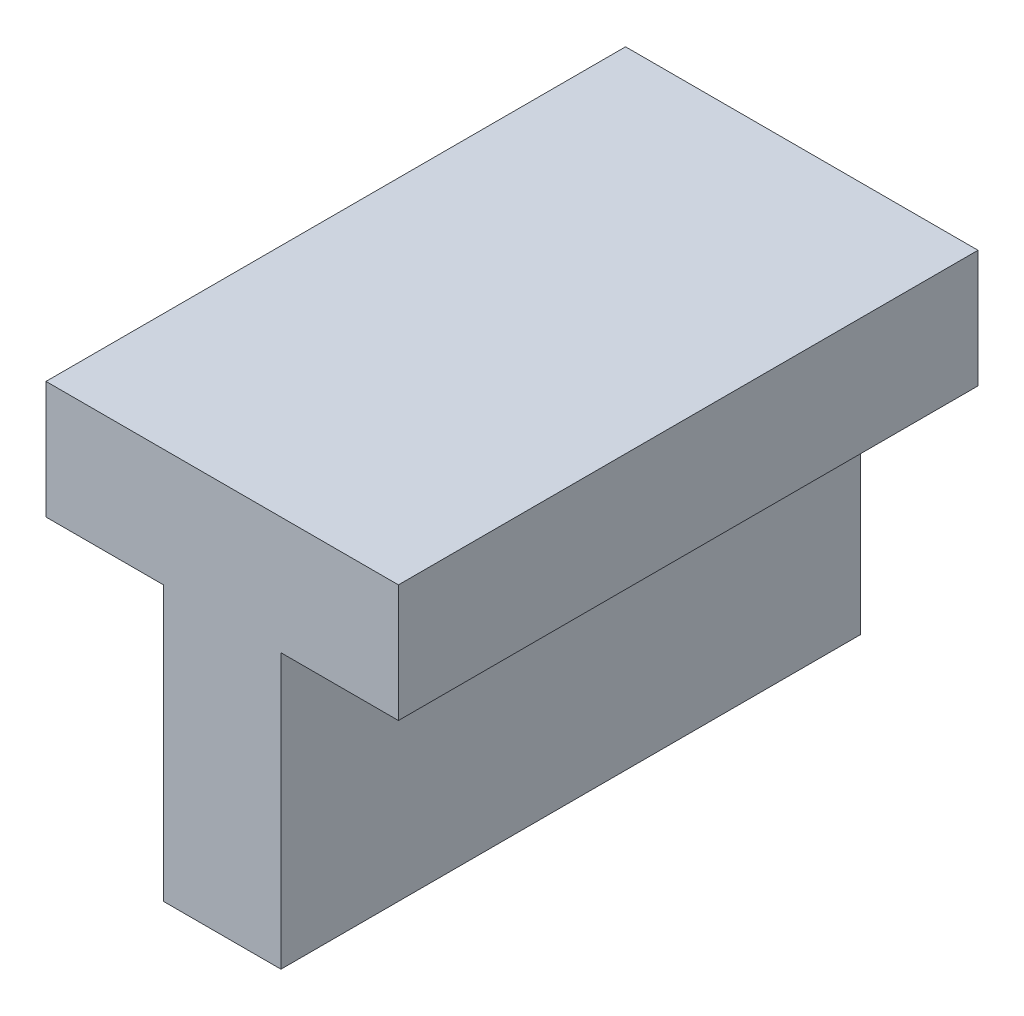
ISO-10303-21;
HEADER;
FILE_DESCRIPTION(('STEP AP214'),'2;1');
FILE_NAME('part.step','',(''),(''),'','','');
FILE_SCHEMA(('AUTOMOTIVE_DESIGN { 1 0 10303 214 1 1 1 1 }'));
ENDSEC;
DATA;
#1=APPLICATION_CONTEXT('core data for automotive mechanical design processes');
#2=APPLICATION_PROTOCOL_DEFINITION('international standard','automotive_design',2000,#1);
#3=PRODUCT_CONTEXT('',#1,'mechanical');
#4=PRODUCT('Part','Part','',(#3));
#5=PRODUCT_RELATED_PRODUCT_CATEGORY('part','',(#4));
#6=PRODUCT_DEFINITION_FORMATION('','',#4);
#7=PRODUCT_DEFINITION_CONTEXT('part definition',#1,'design');
#8=PRODUCT_DEFINITION('design','',#6,#7);
#9=PRODUCT_DEFINITION_SHAPE('','',#8);
#10=(LENGTH_UNIT() NAMED_UNIT(*) SI_UNIT(.MILLI.,.METRE.));
#11=(NAMED_UNIT(*) PLANE_ANGLE_UNIT() SI_UNIT($,.RADIAN.));
#12=(NAMED_UNIT(*) SI_UNIT($,.STERADIAN.) SOLID_ANGLE_UNIT());
#13=UNCERTAINTY_MEASURE_WITH_UNIT(LENGTH_MEASURE(1.E-05),#10,'distance_accuracy_value','');
#14=(GEOMETRIC_REPRESENTATION_CONTEXT(3) GLOBAL_UNCERTAINTY_ASSIGNED_CONTEXT((#13)) GLOBAL_UNIT_ASSIGNED_CONTEXT((#10,
#11,#12)) REPRESENTATION_CONTEXT('',''));
#15=CARTESIAN_POINT('',(0.,0.,0.));
#16=DIRECTION('',(0.,0.,1.));
#17=DIRECTION('',(1.,0.,0.));
#18=AXIS2_PLACEMENT_3D('',#15,#16,#17);
#19=CARTESIAN_POINT('',(-1.5,-3.,14.8));
#20=DIRECTION('',(1.,0.,0.));
#21=DIRECTION('',(0.,1.,0.));
#22=AXIS2_PLACEMENT_3D('',#19,#20,#21);
#23=PLANE('',#22);
#24=DIRECTION('',(0.,-1.,0.));
#25=VECTOR('',#24,1.);
#26=CARTESIAN_POINT('',(-1.5,-3.,0.));
#27=LINE('',#26,#25);
#28=CARTESIAN_POINT('',(-1.5,-3.,0.));
#29=VERTEX_POINT('',#28);
#30=CARTESIAN_POINT('',(-1.5,-10.,0.));
#31=VERTEX_POINT('',#30);
#32=EDGE_CURVE('E132',#29,#31,#27,.T.);
#33=ORIENTED_EDGE('',*,*,#32,.T.);
#34=DIRECTION('',(0.,0.,-1.));
#35=VECTOR('',#34,1.);
#36=CARTESIAN_POINT('',(-1.5,-10.,14.8));
#37=LINE('',#36,#35);
#38=CARTESIAN_POINT('',(-1.5,-10.,14.8));
#39=VERTEX_POINT('',#38);
#40=EDGE_CURVE('E11',#39,#31,#37,.T.);
#41=ORIENTED_EDGE('',*,*,#40,.F.);
#42=DIRECTION('',(0.,-1.,0.));
#43=VECTOR('',#42,1.);
#44=CARTESIAN_POINT('',(-1.5,-3.,14.8));
#45=LINE('',#44,#43);
#46=CARTESIAN_POINT('',(-1.5,-3.,14.8));
#47=VERTEX_POINT('',#46);
#48=EDGE_CURVE('E146',#47,#39,#45,.T.);
#49=ORIENTED_EDGE('',*,*,#48,.F.);
#50=DIRECTION('',(0.,0.,-1.));
#51=VECTOR('',#50,1.);
#52=CARTESIAN_POINT('',(-1.5,-3.,14.8));
#53=LINE('',#52,#51);
#54=EDGE_CURVE('E128',#47,#29,#53,.T.);
#55=ORIENTED_EDGE('',*,*,#54,.T.);
#56=EDGE_LOOP('',(#33,#41,#49,#55));
#57=FACE_BOUND('',#56,.T.);
#58=ADVANCED_FACE('F36',(#57),#23,.F.);
#59=CARTESIAN_POINT('',(-1.5,-10.,14.8));
#60=DIRECTION('',(0.,1.,0.));
#61=DIRECTION('',(0.,0.,1.));
#62=AXIS2_PLACEMENT_3D('',#59,#60,#61);
#63=PLANE('',#62);
#64=DIRECTION('',(1.,0.,0.));
#65=VECTOR('',#64,1.);
#66=CARTESIAN_POINT('',(-1.5,-10.,0.));
#67=LINE('',#66,#65);
#68=CARTESIAN_POINT('',(1.5,-10.,0.));
#69=VERTEX_POINT('',#68);
#70=EDGE_CURVE('E135',#31,#69,#67,.T.);
#71=ORIENTED_EDGE('',*,*,#70,.T.);
#72=DIRECTION('',(0.,0.,-1.));
#73=VECTOR('',#72,1.);
#74=CARTESIAN_POINT('',(1.5,-10.,14.8));
#75=LINE('',#74,#73);
#76=CARTESIAN_POINT('',(1.5,-10.,14.8));
#77=VERTEX_POINT('',#76);
#78=EDGE_CURVE('E44',#77,#69,#75,.T.);
#79=ORIENTED_EDGE('',*,*,#78,.F.);
#80=DIRECTION('',(1.,0.,0.));
#81=VECTOR('',#80,1.);
#82=CARTESIAN_POINT('',(-1.5,-10.,14.8));
#83=LINE('',#82,#81);
#84=EDGE_CURVE('E95',#39,#77,#83,.T.);
#85=ORIENTED_EDGE('',*,*,#84,.F.);
#86=ORIENTED_EDGE('',*,*,#40,.T.);
#87=EDGE_LOOP('',(#71,#79,#85,#86));
#88=FACE_BOUND('',#87,.T.);
#89=ADVANCED_FACE('F181',(#88),#63,.F.);
#90=CARTESIAN_POINT('',(1.5,-10.,14.8));
#91=DIRECTION('',(-1.,0.,0.));
#92=DIRECTION('',(0.,-1.,0.));
#93=AXIS2_PLACEMENT_3D('',#90,#91,#92);
#94=PLANE('',#93);
#95=DIRECTION('',(0.,1.,0.));
#96=VECTOR('',#95,1.);
#97=CARTESIAN_POINT('',(1.5,-10.,0.));
#98=LINE('',#97,#96);
#99=CARTESIAN_POINT('',(1.5,-3.,0.));
#100=VERTEX_POINT('',#99);
#101=EDGE_CURVE('E137',#69,#100,#98,.T.);
#102=ORIENTED_EDGE('',*,*,#101,.T.);
#103=DIRECTION('',(0.,0.,-1.));
#104=VECTOR('',#103,1.);
#105=CARTESIAN_POINT('',(1.5,-3.,14.8));
#106=LINE('',#105,#104);
#107=CARTESIAN_POINT('',(1.5,-3.,14.8));
#108=VERTEX_POINT('',#107);
#109=EDGE_CURVE('E153',#108,#100,#106,.T.);
#110=ORIENTED_EDGE('',*,*,#109,.F.);
#111=DIRECTION('',(0.,1.,0.));
#112=VECTOR('',#111,1.);
#113=CARTESIAN_POINT('',(1.5,-10.,14.8));
#114=LINE('',#113,#112);
#115=EDGE_CURVE('E161',#77,#108,#114,.T.);
#116=ORIENTED_EDGE('',*,*,#115,.F.);
#117=ORIENTED_EDGE('',*,*,#78,.T.);
#118=EDGE_LOOP('',(#102,#110,#116,#117));
#119=FACE_BOUND('',#118,.T.);
#120=ADVANCED_FACE('F159',(#119),#94,.F.);
#121=CARTESIAN_POINT('',(1.5,-3.,14.8));
#122=DIRECTION('',(0.,1.,0.));
#123=DIRECTION('',(-1.,0.,0.));
#124=AXIS2_PLACEMENT_3D('',#121,#122,#123);
#125=PLANE('',#124);
#126=DIRECTION('',(1.,0.,0.));
#127=VECTOR('',#126,1.);
#128=CARTESIAN_POINT('',(1.5,-3.,0.));
#129=LINE('',#128,#127);
#130=CARTESIAN_POINT('',(4.5,-3.,0.));
#131=VERTEX_POINT('',#130);
#132=EDGE_CURVE('E139',#100,#131,#129,.T.);
#133=ORIENTED_EDGE('',*,*,#132,.T.);
#134=DIRECTION('',(0.,0.,-1.));
#135=VECTOR('',#134,1.);
#136=CARTESIAN_POINT('',(4.5,-3.,14.8));
#137=LINE('',#136,#135);
#138=CARTESIAN_POINT('',(4.5,-3.,14.8));
#139=VERTEX_POINT('',#138);
#140=EDGE_CURVE('E150',#139,#131,#137,.T.);
#141=ORIENTED_EDGE('',*,*,#140,.F.);
#142=DIRECTION('',(1.,0.,0.));
#143=VECTOR('',#142,1.);
#144=CARTESIAN_POINT('',(1.5,-3.,14.8));
#145=LINE('',#144,#143);
#146=EDGE_CURVE('E173',#108,#139,#145,.T.);
#147=ORIENTED_EDGE('',*,*,#146,.F.);
#148=ORIENTED_EDGE('',*,*,#109,.T.);
#149=EDGE_LOOP('',(#133,#141,#147,#148));
#150=FACE_BOUND('',#149,.T.);
#151=ADVANCED_FACE('F169',(#150),#125,.F.);
#152=CARTESIAN_POINT('',(4.5,-3.,14.8));
#153=DIRECTION('',(-1.,0.,0.));
#154=DIRECTION('',(0.,-1.,0.));
#155=AXIS2_PLACEMENT_3D('',#152,#153,#154);
#156=PLANE('',#155);
#157=DIRECTION('',(0.,1.,0.));
#158=VECTOR('',#157,1.);
#159=CARTESIAN_POINT('',(4.5,-3.,0.));
#160=LINE('',#159,#158);
#161=CARTESIAN_POINT('',(4.5,0.,0.));
#162=VERTEX_POINT('',#161);
#163=EDGE_CURVE('E141',#131,#162,#160,.T.);
#164=ORIENTED_EDGE('',*,*,#163,.T.);
#165=DIRECTION('',(0.,0.,-1.));
#166=VECTOR('',#165,1.);
#167=CARTESIAN_POINT('',(4.5,0.,14.8));
#168=LINE('',#167,#166);
#169=CARTESIAN_POINT('',(4.5,0.,14.8));
#170=VERTEX_POINT('',#169);
#171=EDGE_CURVE('E123',#170,#162,#168,.T.);
#172=ORIENTED_EDGE('',*,*,#171,.F.);
#173=DIRECTION('',(0.,1.,0.));
#174=VECTOR('',#173,1.);
#175=CARTESIAN_POINT('',(4.5,-3.,14.8));
#176=LINE('',#175,#174);
#177=EDGE_CURVE('E114',#139,#170,#176,.T.);
#178=ORIENTED_EDGE('',*,*,#177,.F.);
#179=ORIENTED_EDGE('',*,*,#140,.T.);
#180=EDGE_LOOP('',(#164,#172,#178,#179));
#181=FACE_BOUND('',#180,.T.);
#182=ADVANCED_FACE('F172',(#181),#156,.F.);
#183=CARTESIAN_POINT('',(4.5,0.,14.8));
#184=DIRECTION('',(0.,-1.,0.));
#185=DIRECTION('',(0.,0.,-1.));
#186=AXIS2_PLACEMENT_3D('',#183,#184,#185);
#187=PLANE('',#186);
#188=DIRECTION('',(-1.,0.,0.));
#189=VECTOR('',#188,1.);
#190=CARTESIAN_POINT('',(4.5,0.,0.));
#191=LINE('',#190,#189);
#192=CARTESIAN_POINT('',(-4.5,0.,0.));
#193=VERTEX_POINT('',#192);
#194=EDGE_CURVE('E122',#162,#193,#191,.T.);
#195=ORIENTED_EDGE('',*,*,#194,.T.);
#196=DIRECTION('',(0.,0.,-1.));
#197=VECTOR('',#196,1.);
#198=CARTESIAN_POINT('',(-4.5,0.,14.8));
#199=LINE('',#198,#197);
#200=CARTESIAN_POINT('',(-4.5,0.,14.8));
#201=VERTEX_POINT('',#200);
#202=EDGE_CURVE('E119',#201,#193,#199,.T.);
#203=ORIENTED_EDGE('',*,*,#202,.F.);
#204=DIRECTION('',(-1.,0.,0.));
#205=VECTOR('',#204,1.);
#206=CARTESIAN_POINT('',(4.5,0.,14.8));
#207=LINE('',#206,#205);
#208=EDGE_CURVE('E108',#170,#201,#207,.T.);
#209=ORIENTED_EDGE('',*,*,#208,.F.);
#210=ORIENTED_EDGE('',*,*,#171,.T.);
#211=EDGE_LOOP('',(#195,#203,#209,#210));
#212=FACE_BOUND('',#211,.T.);
#213=ADVANCED_FACE('F120',(#212),#187,.F.);
#214=CARTESIAN_POINT('',(-4.5,0.,14.8));
#215=DIRECTION('',(1.,0.,0.));
#216=DIRECTION('',(0.,1.,0.));
#217=AXIS2_PLACEMENT_3D('',#214,#215,#216);
#218=PLANE('',#217);
#219=DIRECTION('',(0.,-1.,0.));
#220=VECTOR('',#219,1.);
#221=CARTESIAN_POINT('',(-4.5,0.,0.));
#222=LINE('',#221,#220);
#223=CARTESIAN_POINT('',(-4.5,-3.,0.));
#224=VERTEX_POINT('',#223);
#225=EDGE_CURVE('E81',#193,#224,#222,.T.);
#226=ORIENTED_EDGE('',*,*,#225,.T.);
#227=DIRECTION('',(0.,0.,-1.));
#228=VECTOR('',#227,1.);
#229=CARTESIAN_POINT('',(-4.5,-3.,14.8));
#230=LINE('',#229,#228);
#231=CARTESIAN_POINT('',(-4.5,-3.,14.8));
#232=VERTEX_POINT('',#231);
#233=EDGE_CURVE('E124',#232,#224,#230,.T.);
#234=ORIENTED_EDGE('',*,*,#233,.F.);
#235=DIRECTION('',(0.,-1.,0.));
#236=VECTOR('',#235,1.);
#237=CARTESIAN_POINT('',(-4.5,0.,14.8));
#238=LINE('',#237,#236);
#239=EDGE_CURVE('E112',#201,#232,#238,.T.);
#240=ORIENTED_EDGE('',*,*,#239,.F.);
#241=ORIENTED_EDGE('',*,*,#202,.T.);
#242=EDGE_LOOP('',(#226,#234,#240,#241));
#243=FACE_BOUND('',#242,.T.);
#244=ADVANCED_FACE('F126',(#243),#218,.F.);
#245=CARTESIAN_POINT('',(-4.5,-3.,14.8));
#246=DIRECTION('',(0.,1.,0.));
#247=DIRECTION('',(0.,0.,1.));
#248=AXIS2_PLACEMENT_3D('',#245,#246,#247);
#249=PLANE('',#248);
#250=DIRECTION('',(1.,0.,0.));
#251=VECTOR('',#250,1.);
#252=CARTESIAN_POINT('',(-4.5,-3.,0.));
#253=LINE('',#252,#251);
#254=EDGE_CURVE('E87',#224,#29,#253,.T.);
#255=ORIENTED_EDGE('',*,*,#254,.T.);
#256=ORIENTED_EDGE('',*,*,#54,.F.);
#257=DIRECTION('',(1.,0.,0.));
#258=VECTOR('',#257,1.);
#259=CARTESIAN_POINT('',(-4.5,-3.,14.8));
#260=LINE('',#259,#258);
#261=EDGE_CURVE('E52',#232,#47,#260,.T.);
#262=ORIENTED_EDGE('',*,*,#261,.F.);
#263=ORIENTED_EDGE('',*,*,#233,.T.);
#264=EDGE_LOOP('',(#255,#256,#262,#263));
#265=FACE_BOUND('',#264,.T.);
#266=ADVANCED_FACE('F197',(#265),#249,.F.);
#267=CARTESIAN_POINT('',(0.,0.,14.8));
#268=DIRECTION('',(0.,0.,1.));
#269=DIRECTION('',(1.,0.,0.));
#270=AXIS2_PLACEMENT_3D('',#267,#268,#269);
#271=PLANE('',#270);
#272=ORIENTED_EDGE('',*,*,#48,.T.);
#273=ORIENTED_EDGE('',*,*,#84,.T.);
#274=ORIENTED_EDGE('',*,*,#115,.T.);
#275=ORIENTED_EDGE('',*,*,#146,.T.);
#276=ORIENTED_EDGE('',*,*,#177,.T.);
#277=ORIENTED_EDGE('',*,*,#208,.T.);
#278=ORIENTED_EDGE('',*,*,#239,.T.);
#279=ORIENTED_EDGE('',*,*,#261,.T.);
#280=EDGE_LOOP('',(#272,#273,#274,#275,#276,#277,#278,#279));
#281=FACE_BOUND('',#280,.T.);
#282=ADVANCED_FACE('F110',(#281),#271,.T.);
#283=CARTESIAN_POINT('',(0.,0.,0.));
#284=DIRECTION('',(0.,0.,1.));
#285=DIRECTION('',(1.,0.,0.));
#286=AXIS2_PLACEMENT_3D('',#283,#284,#285);
#287=PLANE('',#286);
#288=ORIENTED_EDGE('',*,*,#32,.F.);
#289=ORIENTED_EDGE('',*,*,#254,.F.);
#290=ORIENTED_EDGE('',*,*,#225,.F.);
#291=ORIENTED_EDGE('',*,*,#194,.F.);
#292=ORIENTED_EDGE('',*,*,#163,.F.);
#293=ORIENTED_EDGE('',*,*,#132,.F.);
#294=ORIENTED_EDGE('',*,*,#101,.F.);
#295=ORIENTED_EDGE('',*,*,#70,.F.);
#296=EDGE_LOOP('',(#288,#289,#290,#291,#292,#293,#294,#295));
#297=FACE_BOUND('',#296,.T.);
#298=ADVANCED_FACE('F165',(#297),#287,.F.);
#299=CLOSED_SHELL('',(#58,#89,#120,#151,#182,#213,#244,#266,#282,#298));
#300=MANIFOLD_SOLID_BREP('B2',#299);
#301=ADVANCED_BREP_SHAPE_REPRESENTATION('',(#18,#300),#14);
#302=SHAPE_DEFINITION_REPRESENTATION(#9,#301);
ENDSEC;
END-ISO-10303-21;
